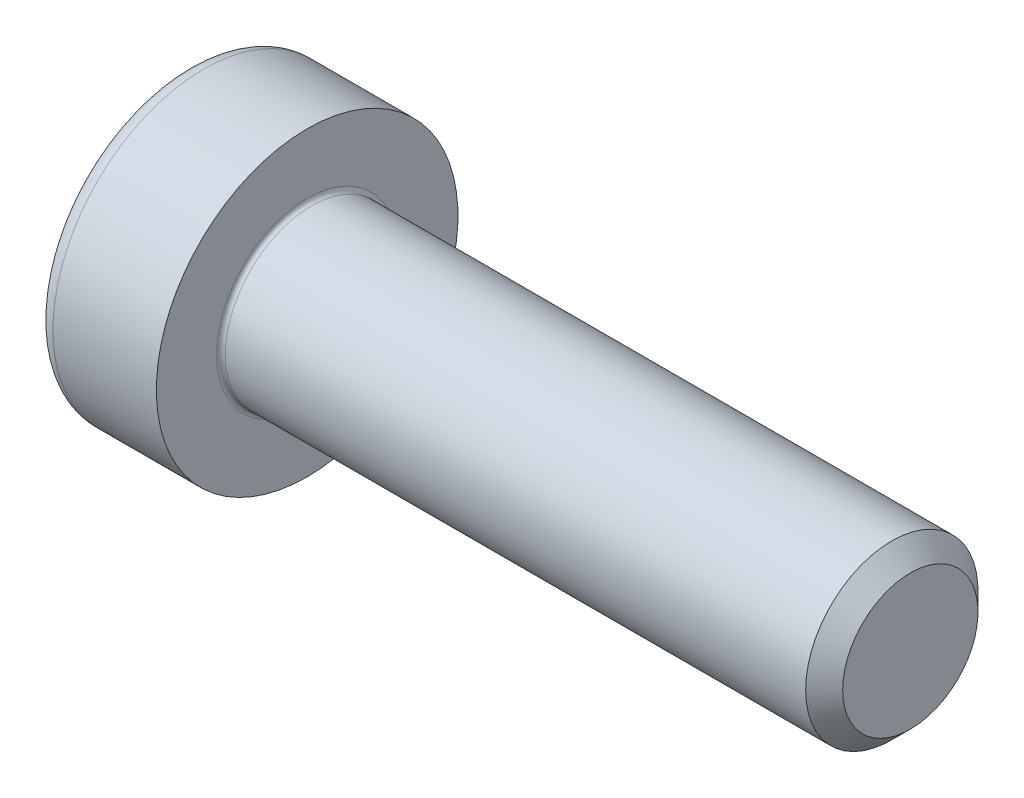
ISO-10303-21;
HEADER;
FILE_DESCRIPTION(('STEP AP214'),'2;1');
FILE_NAME('part.step','',(''),(''),'','','');
FILE_SCHEMA(('AUTOMOTIVE_DESIGN { 1 0 10303 214 1 1 1 1 }'));
ENDSEC;
DATA;
#1=APPLICATION_CONTEXT('core data for automotive mechanical design processes');
#2=APPLICATION_PROTOCOL_DEFINITION('international standard','automotive_design',2000,#1);
#3=PRODUCT_CONTEXT('',#1,'mechanical');
#4=PRODUCT('Part','Part','',(#3));
#5=PRODUCT_RELATED_PRODUCT_CATEGORY('part','',(#4));
#6=PRODUCT_DEFINITION_FORMATION('','',#4);
#7=PRODUCT_DEFINITION_CONTEXT('part definition',#1,'design');
#8=PRODUCT_DEFINITION('design','',#6,#7);
#9=PRODUCT_DEFINITION_SHAPE('','',#8);
#10=(LENGTH_UNIT() NAMED_UNIT(*) SI_UNIT(.MILLI.,.METRE.));
#11=(NAMED_UNIT(*) PLANE_ANGLE_UNIT() SI_UNIT($,.RADIAN.));
#12=(NAMED_UNIT(*) SI_UNIT($,.STERADIAN.) SOLID_ANGLE_UNIT());
#13=UNCERTAINTY_MEASURE_WITH_UNIT(LENGTH_MEASURE(1.E-05),#10,'distance_accuracy_value','');
#14=(GEOMETRIC_REPRESENTATION_CONTEXT(3) GLOBAL_UNCERTAINTY_ASSIGNED_CONTEXT((#13)) GLOBAL_UNIT_ASSIGNED_CONTEXT((#10,
#11,#12)) REPRESENTATION_CONTEXT('',''));
#15=CARTESIAN_POINT('',(0.,0.,0.));
#16=DIRECTION('',(0.,0.,1.));
#17=DIRECTION('',(1.,0.,0.));
#18=AXIS2_PLACEMENT_3D('',#15,#16,#17);
#19=CARTESIAN_POINT('',(-2.8,-1.25,0.721687836487033));
#20=DIRECTION('',(0.,-0.5,0.866025403784439));
#21=DIRECTION('',(0.,-0.866025403784439,-0.5));
#22=AXIS2_PLACEMENT_3D('',#19,#20,#21);
#23=PLANE('',#22);
#24=DIRECTION('',(1.,0.,0.));
#25=VECTOR('',#24,1.);
#26=CARTESIAN_POINT('',(-2.8,-1.25,0.721687836487032));
#27=LINE('',#26,#25);
#28=CARTESIAN_POINT('',(-0.500000000012726,-1.24999999999841,0.721687836486114));
#29=VERTEX_POINT('',#28);
#30=CARTESIAN_POINT('',(-2.8,-1.25,0.721687836487032));
#31=VERTEX_POINT('',#30);
#32=EDGE_CURVE('E78',#29,#31,#27,.F.);
#33=ORIENTED_EDGE('',*,*,#32,.T.);
#34=DIRECTION('',(0.,-0.866025403784439,-0.5));
#35=VECTOR('',#34,1.);
#36=CARTESIAN_POINT('',(-2.8,-1.25,0.721687836487033));
#37=LINE('',#36,#35);
#38=CARTESIAN_POINT('',(-2.8,0.,1.44337567297406));
#39=VERTEX_POINT('',#38);
#40=EDGE_CURVE('E84',#39,#31,#37,.T.);
#41=ORIENTED_EDGE('',*,*,#40,.F.);
#42=DIRECTION('',(1.,0.,0.));
#43=VECTOR('',#42,1.);
#44=CARTESIAN_POINT('',(-2.8,0.,1.44337567297406));
#45=LINE('',#44,#43);
#46=CARTESIAN_POINT('',(-0.500000000013255,-1.59207147382935E-12,1.44337567297314));
#47=VERTEX_POINT('',#46);
#48=EDGE_CURVE('E81',#39,#47,#45,.T.);
#49=ORIENTED_EDGE('',*,*,#48,.T.);
#50=CARTESIAN_POINT('',(-0.500000000012726,-1.24999999999682,0.72168783648887));
#51=CARTESIAN_POINT('',(-0.481684715716377,-1.19507007026983,0.753401646203316));
#52=CARTESIAN_POINT('',(-0.465027923199401,-1.13966598617085,0.785389209072065));
#53=CARTESIAN_POINT('',(-0.435953992136175,-1.0278985333175,0.849918178063587));
#54=CARTESIAN_POINT('',(-0.423547137722017,-0.971533179318236,0.882460730368029));
#55=CARTESIAN_POINT('',(-0.404234974351635,-0.859500978896518,0.947142551439414));
#56=CARTESIAN_POINT('',(-0.397201117258309,-0.803851365235418,0.979271870866949));
#57=CARTESIAN_POINT('',(-0.388805730091798,-0.69229042470667,1.04368160991227));
#58=CARTESIAN_POINT('',(-0.387437246244261,-0.636379503054475,1.0759617955788));
#59=CARTESIAN_POINT('',(-0.390291431357509,-0.531915943927224,1.13627385956143));
#60=CARTESIAN_POINT('',(-0.393813303271098,-0.483347630844075,1.16431478819407));
#61=CARTESIAN_POINT('',(-0.404973312960129,-0.386527411394851,1.22021396795608));
#62=CARTESIAN_POINT('',(-0.412615259241871,-0.338275839654115,1.24807202588941));
#63=CARTESIAN_POINT('',(-0.431718645848268,-0.241256161421971,1.30408636323343));
#64=CARTESIAN_POINT('',(-0.443261026398436,-0.192500327885751,1.33223555685014));
#65=CARTESIAN_POINT('',(-0.469457350536955,-0.0957156437487544,1.38811422029006));
#66=CARTESIAN_POINT('',(-0.484105142982673,-0.0476855541807888,1.41584440543133));
#67=CARTESIAN_POINT('',(-0.500000000012726,-3.18408876986919E-12,1.44337567297223));
#68=B_SPLINE_CURVE_WITH_KNOTS('',3,(#50,#51,#52,#53,#54,#55,#56,#57,#58,#59,#60,#61,#62,#63,#64,
#65,#66,#67),.UNSPECIFIED.,.F.,.F.,(4,2,2,2,2,2,2,2,4),(0.,0.198135007223765,0.396746135643436,
0.590442253847539,0.783900555563555,0.952317364145102,1.12089012111943,1.2932010140512,
1.46517373344049),.UNSPECIFIED.);
#69=EDGE_CURVE('E20',#29,#47,#68,.T.);
#70=ORIENTED_EDGE('',*,*,#69,.F.);
#71=EDGE_LOOP('',(#33,#41,#49,#70));
#72=FACE_BOUND('',#71,.T.);
#73=ADVANCED_FACE('F16',(#72),#23,.F.);
#74=CARTESIAN_POINT('',(-2.8,-1.25,-0.721687836487032));
#75=DIRECTION('',(0.,-1.,0.));
#76=DIRECTION('',(1.,0.,0.));
#77=AXIS2_PLACEMENT_3D('',#74,#75,#76);
#78=PLANE('',#77);
#79=DIRECTION('',(1.,0.,0.));
#80=VECTOR('',#79,1.);
#81=CARTESIAN_POINT('',(-2.8,-1.25,-0.721687836487029));
#82=LINE('',#81,#80);
#83=CARTESIAN_POINT('',(-0.49999999816412,-1.25,-0.7216878300796));
#84=VERTEX_POINT('',#83);
#85=CARTESIAN_POINT('',(-2.8,-1.25,-0.72168783648703));
#86=VERTEX_POINT('',#85);
#87=EDGE_CURVE('E167',#84,#86,#82,.F.);
#88=ORIENTED_EDGE('',*,*,#87,.T.);
#89=DIRECTION('',(0.,0.,1.));
#90=VECTOR('',#89,1.);
#91=CARTESIAN_POINT('',(-2.8,-1.25,-0.721687836487032));
#92=LINE('',#91,#90);
#93=EDGE_CURVE('E95',#31,#86,#92,.F.);
#94=ORIENTED_EDGE('',*,*,#93,.F.);
#95=ORIENTED_EDGE('',*,*,#32,.F.);
#96=CARTESIAN_POINT('',(-0.499999996314455,-1.25,-0.721687823672171));
#97=CARTESIAN_POINT('',(-0.481684712320678,-1.25,-0.658260204455308));
#98=CARTESIAN_POINT('',(-0.465027920125363,-1.25,-0.594285078931179));
#99=CARTESIAN_POINT('',(-0.435953989730311,-1.25,-0.465227141395604));
#100=CARTESIAN_POINT('',(-0.423547135662282,-1.25,-0.400142037020951));
#101=CARTESIAN_POINT('',(-0.404234972978452,-1.25,-0.270778395346219));
#102=CARTESIAN_POINT('',(-0.397201116226907,-1.25,-0.206519756724117));
#103=CARTESIAN_POINT('',(-0.388805729720173,-1.25,-0.0777002791266702));
#104=CARTESIAN_POINT('',(-0.387437246190876,-1.25,-0.0131399080537761));
#105=CARTESIAN_POINT('',(-0.390291431832533,-1.25,0.107484218823611));
#106=CARTESIAN_POINT('',(-0.393813303918129,-1.25,0.163566075265566));
#107=CARTESIAN_POINT('',(-0.404973313813457,-1.25,0.27536443314025));
#108=CARTESIAN_POINT('',(-0.412615260129186,-1.25,0.331080548180939));
#109=CARTESIAN_POINT('',(-0.431718646676558,-1.25,0.443109221187627));
#110=CARTESIAN_POINT('',(-0.443261027129272,-1.25,0.499407607566286));
#111=CARTESIAN_POINT('',(-0.469457350971283,-1.25,0.611164932762984));
#112=CARTESIAN_POINT('',(-0.484105143218355,-1.25,0.666625302217014));
#113=CARTESIAN_POINT('',(-0.500000000012726,-1.25,0.721687836483357));
#114=B_SPLINE_CURVE_WITH_KNOTS('',3,(#96,#97,#98,#99,#100,#101,#102,#103,#104,#105,#106,#107,
#108,#109,#110,#111,#112,#113),.UNSPECIFIED.,.F.,.F.,(4,2,2,2,2,2,2,2,4),(0.,0.19813500635957,
0.396746133892688,0.590442251290265,0.783900552208119,0.952317358365276,1.12089011290585,
1.29320100327195,1.46517372011195),.UNSPECIFIED.);
#115=EDGE_CURVE('E86',#84,#29,#114,.T.);
#116=ORIENTED_EDGE('',*,*,#115,.F.);
#117=EDGE_LOOP('',(#88,#94,#95,#116));
#118=FACE_BOUND('',#117,.T.);
#119=ADVANCED_FACE('F96',(#118),#78,.F.);
#120=CARTESIAN_POINT('',(-2.8,0.,1.44337567297406));
#121=DIRECTION('',(0.,0.500000000000001,0.866025403784438));
#122=DIRECTION('',(0.,-0.866025403784438,0.500000000000001));
#123=AXIS2_PLACEMENT_3D('',#120,#121,#122);
#124=PLANE('',#123);
#125=ORIENTED_EDGE('',*,*,#48,.F.);
#126=DIRECTION('',(0.,-0.866025403784438,0.500000000000001));
#127=VECTOR('',#126,1.);
#128=CARTESIAN_POINT('',(-2.8,0.,1.44337567297406));
#129=LINE('',#128,#127);
#130=CARTESIAN_POINT('',(-2.8,1.25,0.721687836487029));
#131=VERTEX_POINT('',#130);
#132=EDGE_CURVE('E94',#131,#39,#129,.T.);
#133=ORIENTED_EDGE('',*,*,#132,.F.);
#134=DIRECTION('',(1.,0.,0.));
#135=VECTOR('',#134,1.);
#136=CARTESIAN_POINT('',(-2.8,1.25,0.72168783648703));
#137=LINE('',#136,#135);
#138=CARTESIAN_POINT('',(-0.500000004821645,1.25000001442358,0.721687828159571));
#139=VERTEX_POINT('',#138);
#140=EDGE_CURVE('E268',#131,#139,#137,.T.);
#141=ORIENTED_EDGE('',*,*,#140,.T.);
#142=CARTESIAN_POINT('',(-0.500000000012724,3.18080665090472E-12,1.44337567297222));
#143=CARTESIAN_POINT('',(-0.48168471571384,0.05492992973787,1.41166186325333));
#144=CARTESIAN_POINT('',(-0.465027923194758,0.110334013844639,1.37967430038009));
#145=CARTESIAN_POINT('',(-0.435953992128384,0.222101466714794,1.31514533137886));
#146=CARTESIAN_POINT('',(-0.423547137713265,0.278466820723083,1.28260277906921));
#147=CARTESIAN_POINT('',(-0.404234974345858,0.39049902114616,1.21792095799704));
#148=CARTESIAN_POINT('',(-0.397201117254907,0.446148634799383,1.18579163857405));
#149=CARTESIAN_POINT('',(-0.388805730091247,0.55770957531095,1.12138189953865));
#150=CARTESIAN_POINT('',(-0.387437246244113,0.613620496953838,1.08910171387749));
#151=CARTESIAN_POINT('',(-0.390291431412486,0.71808405807321,1.02878964874471));
#152=CARTESIAN_POINT('',(-0.393813303562025,0.766652373153495,1.00074871895902));
#153=CARTESIAN_POINT('',(-0.404973314047567,0.863472596563807,0.94484953691008));
#154=CARTESIAN_POINT('',(-0.412615260890639,0.911724170268415,0.916991477842901));
#155=CARTESIAN_POINT('',(-0.431718648896679,1.00874385247376,0.860977138204952));
#156=CARTESIAN_POINT('',(-0.443261030295299,1.05749968801736,0.83282794342929));
#157=CARTESIAN_POINT('',(-0.469457356315246,1.15428437609608,0.776949277713607));
#158=CARTESIAN_POINT('',(-0.484105149792817,1.20231446759865,0.749219091455394));
#159=CARTESIAN_POINT('',(-0.500000007908364,1.25000002368374,0.721687822813215));
#160=B_SPLINE_CURVE_WITH_KNOTS('',3,(#142,#143,#144,#145,#146,#147,#148,#149,#150,#151,#152,
#153,#154,#155,#156,#157,#158,#159),.UNSPECIFIED.,.F.,.F.,(4,2,2,2,2,2,2,2,4),(0.,
0.198135007251438,0.396746135702335,0.590442253878284,0.783900555563566,0.952317371073209,
1.12089013500126,1.29320103524786,1.46517376189628),.UNSPECIFIED.);
#161=EDGE_CURVE('E161',#47,#139,#160,.T.);
#162=ORIENTED_EDGE('',*,*,#161,.F.);
#163=EDGE_LOOP('',(#125,#133,#141,#162));
#164=FACE_BOUND('',#163,.T.);
#165=ADVANCED_FACE('F168',(#164),#124,.F.);
#166=CARTESIAN_POINT('',(-2.8,0.,-1.44337567297406));
#167=DIRECTION('',(0.,-0.5,-0.866025403784439));
#168=DIRECTION('',(0.,0.866025403784439,-0.5));
#169=AXIS2_PLACEMENT_3D('',#166,#167,#168);
#170=PLANE('',#169);
#171=DIRECTION('',(1.,0.,0.));
#172=VECTOR('',#171,1.);
#173=CARTESIAN_POINT('',(-2.8,0.,-1.44337567297406));
#174=LINE('',#173,#172);
#175=CARTESIAN_POINT('',(-0.499999992316163,-5.19131567157532E-08,-1.44337565964139));
#176=VERTEX_POINT('',#175);
#177=CARTESIAN_POINT('',(-2.8,0.,-1.44337567297406));
#178=VERTEX_POINT('',#177);
#179=EDGE_CURVE('E262',#176,#178,#174,.F.);
#180=ORIENTED_EDGE('',*,*,#179,.T.);
#181=DIRECTION('',(0.,0.866025403784439,-0.5));
#182=VECTOR('',#181,1.);
#183=CARTESIAN_POINT('',(-2.8,0.,-1.44337567297406));
#184=LINE('',#183,#182);
#185=EDGE_CURVE('E40',#86,#178,#184,.T.);
#186=ORIENTED_EDGE('',*,*,#185,.F.);
#187=ORIENTED_EDGE('',*,*,#87,.F.);
#188=CARTESIAN_POINT('',(-0.500000009620751,-1.2500000288209,-0.721687819847277));
#189=CARTESIAN_POINT('',(-0.481684724546346,-1.19507009864123,-0.753401629823076));
#190=CARTESIAN_POINT('',(-0.46502793120038,-1.13966601408686,-0.785389192954742));
#191=CARTESIAN_POINT('',(-0.435953998411218,-1.02789856027996,-0.8499181624968));
#192=CARTESIAN_POINT('',(-0.423547143100863,-0.971533205782277,-0.882460715089003));
#193=CARTESIAN_POINT('',(-0.404234977937411,-0.85950100431182,-0.947142536765877));
#194=CARTESIAN_POINT('',(-0.39720111994863,-0.803851390101623,-0.979271856510434));
#195=CARTESIAN_POINT('',(-0.388805731059005,-0.692290448408831,-1.04368159622782));
#196=CARTESIAN_POINT('',(-0.387437246383409,-0.636379526141792,-1.07596178224933));
#197=CARTESIAN_POINT('',(-0.390291429949312,-0.531915970874843,-1.13627384400321));
#198=CARTESIAN_POINT('',(-0.393813300668912,-0.483347662263053,-1.16431477005431));
#199=CARTESIAN_POINT('',(-0.404973307299901,-0.386527451645455,-1.22021394471738));
#200=CARTESIAN_POINT('',(-0.412615251715936,-0.338275884264776,-1.24807200013343));
#201=CARTESIAN_POINT('',(-0.431718634043812,-0.241256214830581,-1.30408633239795));
#202=CARTESIAN_POINT('',(-0.443261012160607,-0.192500385727477,-1.33223552345519));
#203=CARTESIAN_POINT('',(-0.469457331112052,-0.095715710284682,-1.38811418187552));
#204=CARTESIAN_POINT('',(-0.484105120806564,-0.0476856249784377,-1.41584436455628));
#205=CARTESIAN_POINT('',(-0.499999975011777,-7.50060251224709E-08,-1.44337562966931));
#206=B_SPLINE_CURVE_WITH_KNOTS('',3,(#188,#189,#190,#191,#192,#193,#194,#195,#196,#197,#198,
#199,#200,#201,#202,#203,#204,#205),.UNSPECIFIED.,.F.,.F.,(4,2,2,2,2,2,2,2,4),(0.,
0.1981350093813,0.396746140005334,0.59044226039392,0.783900564280858,0.952317357223632,
1.12089009850234,1.29320097493783,1.4651736779646),.UNSPECIFIED.);
#207=EDGE_CURVE('E90',#84,#176,#206,.T.);
#208=ORIENTED_EDGE('',*,*,#207,.T.);
#209=EDGE_LOOP('',(#180,#186,#187,#208));
#210=FACE_BOUND('',#209,.T.);
#211=ADVANCED_FACE('F171',(#210),#170,.F.);
#212=CARTESIAN_POINT('',(-2.8,1.25,0.72168783648703));
#213=DIRECTION('',(0.,1.,0.));
#214=DIRECTION('',(0.,0.,1.));
#215=AXIS2_PLACEMENT_3D('',#212,#213,#214);
#216=PLANE('',#215);
#217=ORIENTED_EDGE('',*,*,#140,.F.);
#218=DIRECTION('',(0.,0.,1.));
#219=VECTOR('',#218,1.);
#220=CARTESIAN_POINT('',(-2.8,1.25,0.72168783648703));
#221=LINE('',#220,#219);
#222=CARTESIAN_POINT('',(-2.8,1.25,-0.721687836487033));
#223=VERTEX_POINT('',#222);
#224=EDGE_CURVE('E271',#223,#131,#221,.T.);
#225=ORIENTED_EDGE('',*,*,#224,.F.);
#226=DIRECTION('',(1.,0.,0.));
#227=VECTOR('',#226,1.);
#228=CARTESIAN_POINT('',(-2.8,1.25,-0.721687836487033));
#229=LINE('',#228,#227);
#230=CARTESIAN_POINT('',(-0.500000004817269,1.25,-0.721687853126786));
#231=VERTEX_POINT('',#230);
#232=EDGE_CURVE('E130',#223,#231,#229,.T.);
#233=ORIENTED_EDGE('',*,*,#232,.T.);
#234=CARTESIAN_POINT('',(-0.500000009620752,1.25,-0.721687869766538));
#235=CARTESIAN_POINT('',(-0.481684724546345,1.25,-0.658260249814932));
#236=CARTESIAN_POINT('',(-0.465027931200377,1.25,-0.594285123551593));
#237=CARTESIAN_POINT('',(-0.435953998411213,1.25,-0.465227184467461));
#238=CARTESIAN_POINT('',(-0.423547143100857,1.25,-0.400142079283045));
#239=CARTESIAN_POINT('',(-0.404234977937408,1.25,-0.270778435929295));
#240=CARTESIAN_POINT('',(-0.397201119948629,1.25,-0.20651979644019));
#241=CARTESIAN_POINT('',(-0.388805731059006,1.25,-0.0777003170054429));
#242=CARTESIAN_POINT('',(-0.38743724638341,1.25,-0.0131399449624222));
#243=CARTESIAN_POINT('',(-0.390291429949361,1.25,0.107484178547275));
#244=CARTESIAN_POINT('',(-0.393813300669159,1.25,0.163566030651423));
#245=CARTESIAN_POINT('',(-0.40497330730082,1.25,0.275364379981414));
#246=CARTESIAN_POINT('',(-0.412615251717328,1.25,0.33108049081544));
#247=CARTESIAN_POINT('',(-0.431718634046385,1.25,0.44310915534835));
#248=CARTESIAN_POINT('',(-0.443261012163895,1.25,0.499407537464785));
#249=CARTESIAN_POINT('',(-0.469457331116927,1.25,0.611164854309281));
#250=CARTESIAN_POINT('',(-0.484105120812309,1.25,0.666625219672687));
#251=CARTESIAN_POINT('',(-0.499999975018438,1.25,0.7216877499006));
#252=B_SPLINE_CURVE_WITH_KNOTS('',3,(#234,#235,#236,#237,#238,#239,#240,#241,#242,#243,#244,
#245,#246,#247,#248,#249,#250,#251),.UNSPECIFIED.,.F.,.F.,(4,2,2,2,2,2,2,2,4),(0.,
0.198135009381324,0.396746140005384,0.590442260393947,0.78390056428086,0.952317357229476,
1.12089009851405,1.29320097495571,1.4651736779886),.UNSPECIFIED.);
#253=EDGE_CURVE('E131',#231,#139,#252,.T.);
#254=ORIENTED_EDGE('',*,*,#253,.T.);
#255=EDGE_LOOP('',(#217,#225,#233,#254));
#256=FACE_BOUND('',#255,.T.);
#257=ADVANCED_FACE('F143',(#256),#216,.F.);
#258=CARTESIAN_POINT('',(-0.504999999975553,0.,0.));
#259=DIRECTION('',(-1.,0.,0.));
#260=DIRECTION('',(0.,0.,1.));
#261=AXIS2_PLACEMENT_3D('',#258,#259,#260);
#262=CONICAL_SURFACE('',#261,1.45203592694543,1.04719755118368);
#263=CARTESIAN_POINT('',(0.333333333344399,0.,0.));
#264=VERTEX_POINT('',#263);
#265=VERTEX_LOOP('',#264);
#266=FACE_BOUND('',#265,.T.);
#267=ORIENTED_EDGE('',*,*,#253,.F.);
#268=CARTESIAN_POINT('',(-0.499999996314455,1.249999988902,-0.721687842894464));
#269=CARTESIAN_POINT('',(-0.481684712318148,1.19507005935095,-0.753401652507334));
#270=CARTESIAN_POINT('',(-0.465027920120727,1.13966597542897,-0.785389215273892));
#271=CARTESIAN_POINT('',(-0.435953989722532,1.02789852294635,-0.849918184051369));
#272=CARTESIAN_POINT('',(-0.423547135653544,0.971533169140927,-0.882460736243901));
#273=CARTESIAN_POINT('',(-0.404234972972686,0.859500969123183,-0.947142557082051));
#274=CARTESIAN_POINT('',(-0.397201116223512,0.803851355671706,-0.97927187638856));
#275=CARTESIAN_POINT('',(-0.388805729719625,0.692290415587236,-1.04368161517738));
#276=CARTESIAN_POINT('',(-0.387437246190732,0.636379494169655,-1.07596180070846));
#277=CARTESIAN_POINT('',(-0.390291431887446,0.531915933994866,-1.13627386529588));
#278=CARTESIAN_POINT('',(-0.3938133042087,0.483347619630076,-1.16431479466848));
#279=CARTESIAN_POINT('',(-0.404973314899552,0.386527397653032,-1.22021397588992));
#280=CARTESIAN_POINT('',(-0.412615261775916,0.338275824666179,-1.2480720345427));
#281=CARTESIAN_POINT('',(-0.4317186497212,0.241256143921843,-1.30408637333714));
#282=CARTESIAN_POINT('',(-0.443261031021314,0.192500309120957,-1.33223556768399));
#283=CARTESIAN_POINT('',(-0.469457356742425,0.095715622504775,-1.38811423255528));
#284=CARTESIAN_POINT('',(-0.484105150020072,0.0476855317221033,-1.41584441839786));
#285=CARTESIAN_POINT('',(-0.500000007898593,-2.36544184156069E-08,-1.44337568663095));
#286=B_SPLINE_CURVE_WITH_KNOTS('',3,(#268,#269,#270,#271,#272,#273,#274,#275,#276,#277,#278,
#279,#280,#281,#282,#283,#284,#285),.UNSPECIFIED.,.F.,.F.,(4,2,2,2,2,2,2,2,4),(0.,
0.198135006387209,0.396746133951516,0.590442251320974,0.783900552208132,0.952317365284808,
1.1208901267705,1.29320102444237,1.46517374853252),.UNSPECIFIED.);
#287=EDGE_CURVE('E122',#231,#176,#286,.T.);
#288=ORIENTED_EDGE('',*,*,#287,.T.);
#289=ORIENTED_EDGE('',*,*,#207,.F.);
#290=ORIENTED_EDGE('',*,*,#115,.T.);
#291=ORIENTED_EDGE('',*,*,#69,.T.);
#292=ORIENTED_EDGE('',*,*,#161,.T.);
#293=EDGE_LOOP('',(#267,#288,#289,#290,#291,#292));
#294=FACE_BOUND('',#293,.T.);
#295=ADVANCED_FACE('F88',(#266,#294),#262,.F.);
#296=CARTESIAN_POINT('',(-2.8,1.25,-0.721687836487033));
#297=DIRECTION('',(0.,0.5,-0.866025403784439));
#298=DIRECTION('',(0.,0.866025403784439,0.5));
#299=AXIS2_PLACEMENT_3D('',#296,#297,#298);
#300=PLANE('',#299);
#301=ORIENTED_EDGE('',*,*,#232,.F.);
#302=DIRECTION('',(0.,0.86602540378444,0.499999999999997));
#303=VECTOR('',#302,1.);
#304=CARTESIAN_POINT('',(-2.8,0.,-1.44337567297406));
#305=LINE('',#304,#303);
#306=EDGE_CURVE('E129',#178,#223,#305,.T.);
#307=ORIENTED_EDGE('',*,*,#306,.F.);
#308=ORIENTED_EDGE('',*,*,#179,.F.);
#309=ORIENTED_EDGE('',*,*,#287,.F.);
#310=EDGE_LOOP('',(#301,#307,#308,#309));
#311=FACE_BOUND('',#310,.T.);
#312=ADVANCED_FACE('F138',(#311),#300,.F.);
#313=CARTESIAN_POINT('',(-2.8,2.47168783648703,0.));
#314=DIRECTION('',(-1.,0.,0.));
#315=DIRECTION('',(0.,-1.,0.));
#316=AXIS2_PLACEMENT_3D('',#313,#314,#315);
#317=PLANE('',#316);
#318=ORIENTED_EDGE('',*,*,#185,.T.);
#319=ORIENTED_EDGE('',*,*,#306,.T.);
#320=ORIENTED_EDGE('',*,*,#224,.T.);
#321=ORIENTED_EDGE('',*,*,#132,.T.);
#322=ORIENTED_EDGE('',*,*,#40,.T.);
#323=ORIENTED_EDGE('',*,*,#93,.T.);
#324=EDGE_LOOP('',(#318,#319,#320,#321,#322,#323));
#325=FACE_BOUND('',#324,.T.);
#326=CARTESIAN_POINT('',(-2.8,0.,0.));
#327=DIRECTION('',(1.,0.,0.));
#328=DIRECTION('',(0.,1.,0.));
#329=AXIS2_PLACEMENT_3D('',#326,#327,#328);
#330=CIRCLE('',#329,3.1);
#331=CARTESIAN_POINT('',(-2.8,3.1,0.));
#332=VERTEX_POINT('',#331);
#333=EDGE_CURVE('E243',#332,#332,#330,.T.);
#334=ORIENTED_EDGE('',*,*,#333,.F.);
#335=EDGE_LOOP('',(#334));
#336=FACE_BOUND('',#335,.T.);
#337=ADVANCED_FACE('F230',(#325,#336),#317,.T.);
#338=CARTESIAN_POINT('',(-2.4,0.,0.));
#339=DIRECTION('',(1.,0.,0.));
#340=DIRECTION('',(0.,0.,-1.));
#341=AXIS2_PLACEMENT_3D('',#338,#339,#340);
#342=TOROIDAL_SURFACE('',#341,3.1,0.4);
#343=CARTESIAN_POINT('',(-2.4,0.,0.));
#344=DIRECTION('',(1.,0.,0.));
#345=DIRECTION('',(0.,1.,0.));
#346=AXIS2_PLACEMENT_3D('',#343,#344,#345);
#347=CIRCLE('',#346,3.5);
#348=CARTESIAN_POINT('',(-2.4,3.5,0.));
#349=VERTEX_POINT('',#348);
#350=EDGE_CURVE('E119',#349,#349,#347,.T.);
#351=ORIENTED_EDGE('',*,*,#350,.F.);
#352=EDGE_LOOP('',(#351));
#353=FACE_BOUND('',#352,.T.);
#354=ORIENTED_EDGE('',*,*,#333,.T.);
#355=EDGE_LOOP('',(#354));
#356=FACE_BOUND('',#355,.T.);
#357=ADVANCED_FACE('F225',(#353,#356),#342,.T.);
#358=CARTESIAN_POINT('',(-1.4,0.,0.));
#359=DIRECTION('',(1.,0.,0.));
#360=DIRECTION('',(0.,1.,0.));
#361=AXIS2_PLACEMENT_3D('',#358,#359,#360);
#362=CYLINDRICAL_SURFACE('',#361,3.5);
#363=ORIENTED_EDGE('',*,*,#350,.T.);
#364=EDGE_LOOP('',(#363));
#365=FACE_BOUND('',#364,.T.);
#366=CARTESIAN_POINT('',(0.,0.,0.));
#367=DIRECTION('',(1.,0.,0.));
#368=DIRECTION('',(0.,1.,0.));
#369=AXIS2_PLACEMENT_3D('',#366,#367,#368);
#370=CIRCLE('',#369,3.5);
#371=CARTESIAN_POINT('',(0.,3.5,0.));
#372=VERTEX_POINT('',#371);
#373=EDGE_CURVE('E114',#372,#372,#370,.T.);
#374=ORIENTED_EDGE('',*,*,#373,.F.);
#375=EDGE_LOOP('',(#374));
#376=FACE_BOUND('',#375,.T.);
#377=ADVANCED_FACE('F221',(#365,#376),#362,.T.);
#378=CARTESIAN_POINT('',(14.,1.,0.));
#379=DIRECTION('',(1.,0.,0.));
#380=DIRECTION('',(0.,1.,0.));
#381=AXIS2_PLACEMENT_3D('',#378,#379,#380);
#382=PLANE('',#381);
#383=CARTESIAN_POINT('',(14.0000000000668,0.,0.));
#384=DIRECTION('',(-1.,0.,0.));
#385=DIRECTION('',(0.,0.,1.));
#386=AXIS2_PLACEMENT_3D('',#383,#384,#385);
#387=CIRCLE('',#386,1.57058500002449);
#388=CARTESIAN_POINT('',(14.0000000000668,0.,1.57058500002449));
#389=VERTEX_POINT('',#388);
#390=EDGE_CURVE('E110',#389,#389,#387,.T.);
#391=ORIENTED_EDGE('',*,*,#390,.F.);
#392=EDGE_LOOP('',(#391));
#393=FACE_BOUND('',#392,.T.);
#394=ADVANCED_FACE('F218',(#393),#382,.T.);
#395=CARTESIAN_POINT('',(0.,2.75,0.));
#396=DIRECTION('',(1.,0.,0.));
#397=DIRECTION('',(0.,1.,0.));
#398=AXIS2_PLACEMENT_3D('',#395,#396,#397);
#399=PLANE('',#398);
#400=CARTESIAN_POINT('',(0.,0.,0.));
#401=DIRECTION('',(1.,0.,0.));
#402=DIRECTION('',(0.,1.,0.));
#403=AXIS2_PLACEMENT_3D('',#400,#401,#402);
#404=CIRCLE('',#403,2.1);
#405=CARTESIAN_POINT('',(0.,2.1,0.));
#406=VERTEX_POINT('',#405);
#407=EDGE_CURVE('E113',#406,#406,#404,.F.);
#408=ORIENTED_EDGE('',*,*,#407,.T.);
#409=EDGE_LOOP('',(#408));
#410=FACE_BOUND('',#409,.T.);
#411=ORIENTED_EDGE('',*,*,#373,.T.);
#412=EDGE_LOOP('',(#411));
#413=FACE_BOUND('',#412,.T.);
#414=ADVANCED_FACE('F209',(#410,#413),#399,.T.);
#415=CARTESIAN_POINT('',(13.5705850000818,0.,0.));
#416=DIRECTION('',(-1.,0.,0.));
#417=DIRECTION('',(0.,0.,1.));
#418=AXIS2_PLACEMENT_3D('',#415,#416,#417);
#419=CONICAL_SURFACE('',#418,2.00000000000955,0.785398163397448);
#420=ORIENTED_EDGE('',*,*,#390,.T.);
#421=EDGE_LOOP('',(#420));
#422=FACE_BOUND('',#421,.T.);
#423=CARTESIAN_POINT('',(13.570585,0.,0.));
#424=DIRECTION('',(1.,0.,0.));
#425=DIRECTION('',(0.,1.,0.));
#426=AXIS2_PLACEMENT_3D('',#423,#424,#425);
#427=CIRCLE('',#426,2.);
#428=CARTESIAN_POINT('',(13.570585,2.,0.));
#429=VERTEX_POINT('',#428);
#430=EDGE_CURVE('E31',#429,#429,#427,.F.);
#431=ORIENTED_EDGE('',*,*,#430,.F.);
#432=EDGE_LOOP('',(#431));
#433=FACE_BOUND('',#432,.T.);
#434=ADVANCED_FACE('F188',(#422,#433),#419,.T.);
#435=CARTESIAN_POINT('',(0.100000000000002,0.,0.));
#436=DIRECTION('',(1.,0.,0.));
#437=DIRECTION('',(0.,0.,-1.));
#438=AXIS2_PLACEMENT_3D('',#435,#436,#437);
#439=TOROIDAL_SURFACE('',#438,2.1,0.1);
#440=CARTESIAN_POINT('',(0.100000000000003,0.,0.));
#441=DIRECTION('',(1.,0.,0.));
#442=DIRECTION('',(0.,1.,0.));
#443=AXIS2_PLACEMENT_3D('',#440,#441,#442);
#444=CIRCLE('',#443,2.);
#445=CARTESIAN_POINT('',(0.100000000000003,2.,0.));
#446=VERTEX_POINT('',#445);
#447=EDGE_CURVE('E11',#446,#446,#444,.T.);
#448=ORIENTED_EDGE('',*,*,#447,.F.);
#449=EDGE_LOOP('',(#448));
#450=FACE_BOUND('',#449,.T.);
#451=ORIENTED_EDGE('',*,*,#407,.F.);
#452=EDGE_LOOP('',(#451));
#453=FACE_BOUND('',#452,.T.);
#454=ADVANCED_FACE('F182',(#450,#453),#439,.F.);
#455=CARTESIAN_POINT('',(8.05,0.,0.));
#456=DIRECTION('',(1.,0.,0.));
#457=DIRECTION('',(0.,1.,0.));
#458=AXIS2_PLACEMENT_3D('',#455,#456,#457);
#459=CYLINDRICAL_SURFACE('',#458,2.);
#460=ORIENTED_EDGE('',*,*,#447,.T.);
#461=EDGE_LOOP('',(#460));
#462=FACE_BOUND('',#461,.T.);
#463=ORIENTED_EDGE('',*,*,#430,.T.);
#464=EDGE_LOOP('',(#463));
#465=FACE_BOUND('',#464,.T.);
#466=ADVANCED_FACE('F180',(#462,#465),#459,.T.);
#467=CLOSED_SHELL('',(#73,#119,#165,#211,#257,#295,#312,#337,#357,#377,#394,#414,#434,#454,#466));
#468=MANIFOLD_SOLID_BREP('B1',#467);
#469=ADVANCED_BREP_SHAPE_REPRESENTATION('',(#18,#468),#14);
#470=SHAPE_DEFINITION_REPRESENTATION(#9,#469);
ENDSEC;
END-ISO-10303-21;
